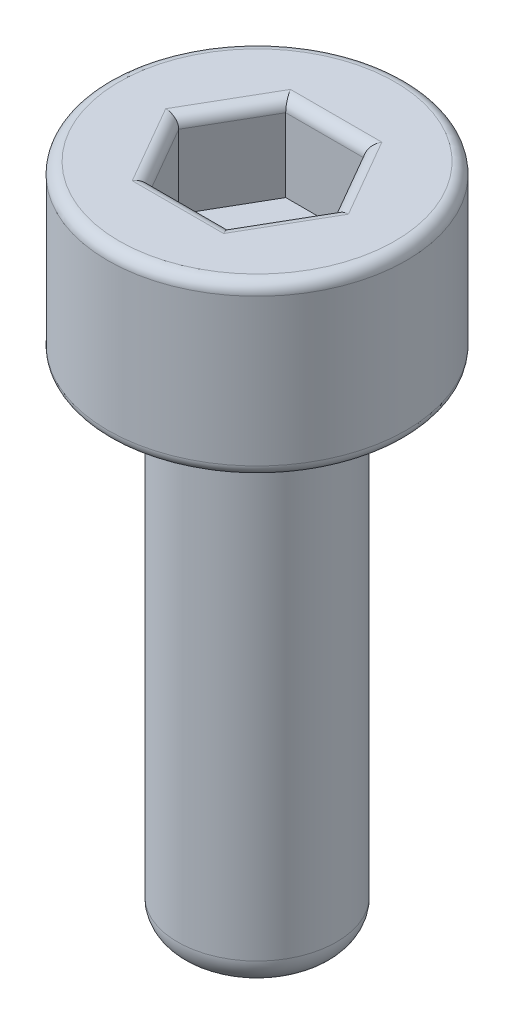
ISO-10303-21;
HEADER;
FILE_DESCRIPTION(('STEP AP214'),'2;1');
FILE_NAME('part.step','',(''),(''),'','','');
FILE_SCHEMA(('AUTOMOTIVE_DESIGN { 1 0 10303 214 1 1 1 1 }'));
ENDSEC;
DATA;
#1=APPLICATION_CONTEXT('core data for automotive mechanical design processes');
#2=APPLICATION_PROTOCOL_DEFINITION('international standard','automotive_design',2000,#1);
#3=PRODUCT_CONTEXT('',#1,'mechanical');
#4=PRODUCT('Part','Part','',(#3));
#5=PRODUCT_RELATED_PRODUCT_CATEGORY('part','',(#4));
#6=PRODUCT_DEFINITION_FORMATION('','',#4);
#7=PRODUCT_DEFINITION_CONTEXT('part definition',#1,'design');
#8=PRODUCT_DEFINITION('design','',#6,#7);
#9=PRODUCT_DEFINITION_SHAPE('','',#8);
#10=(LENGTH_UNIT() NAMED_UNIT(*) SI_UNIT(.MILLI.,.METRE.));
#11=(NAMED_UNIT(*) PLANE_ANGLE_UNIT() SI_UNIT($,.RADIAN.));
#12=(NAMED_UNIT(*) SI_UNIT($,.STERADIAN.) SOLID_ANGLE_UNIT());
#13=UNCERTAINTY_MEASURE_WITH_UNIT(LENGTH_MEASURE(1.E-05),#10,'distance_accuracy_value','');
#14=(GEOMETRIC_REPRESENTATION_CONTEXT(3) GLOBAL_UNCERTAINTY_ASSIGNED_CONTEXT((#13)) GLOBAL_UNIT_ASSIGNED_CONTEXT((#10,
#11,#12)) REPRESENTATION_CONTEXT('',''));
#15=CARTESIAN_POINT('',(0.,0.,0.));
#16=DIRECTION('',(0.,0.,1.));
#17=DIRECTION('',(1.,0.,0.));
#18=AXIS2_PLACEMENT_3D('',#15,#16,#17);
#19=CARTESIAN_POINT('',(0.,3.,0.));
#20=DIRECTION('',(0.,-1.,0.));
#21=DIRECTION('',(0.,0.,-1.));
#22=AXIS2_PLACEMENT_3D('',#19,#20,#21);
#23=CYLINDRICAL_SURFACE('',#22,2.64);
#24=CARTESIAN_POINT('',(0.,2.8,0.));
#25=DIRECTION('',(0.,1.,0.));
#26=DIRECTION('',(0.,0.,1.));
#27=AXIS2_PLACEMENT_3D('',#24,#25,#26);
#28=CIRCLE('',#27,2.64);
#29=CARTESIAN_POINT('',(0.,2.8,2.64));
#30=VERTEX_POINT('',#29);
#31=EDGE_CURVE('E186',#30,#30,#28,.F.);
#32=ORIENTED_EDGE('',*,*,#31,.T.);
#33=EDGE_LOOP('',(#32));
#34=FACE_BOUND('',#33,.T.);
#35=CARTESIAN_POINT('',(0.,0.2,0.));
#36=DIRECTION('',(0.,1.,0.));
#37=DIRECTION('',(0.,0.,1.));
#38=AXIS2_PLACEMENT_3D('',#35,#36,#37);
#39=CIRCLE('',#38,2.64);
#40=CARTESIAN_POINT('',(0.,0.2,2.64));
#41=VERTEX_POINT('',#40);
#42=EDGE_CURVE('E182',#41,#41,#39,.T.);
#43=ORIENTED_EDGE('',*,*,#42,.T.);
#44=EDGE_LOOP('',(#43));
#45=FACE_BOUND('',#44,.T.);
#46=ADVANCED_FACE('F39',(#34,#45),#23,.T.);
#47=CARTESIAN_POINT('',(0.,3.,0.));
#48=DIRECTION('',(0.,1.,0.));
#49=DIRECTION('',(0.,0.,1.));
#50=AXIS2_PLACEMENT_3D('',#47,#48,#49);
#51=PLANE('',#50);
#52=DIRECTION('',(-1.,0.,0.));
#53=VECTOR('',#52,1.);
#54=CARTESIAN_POINT('',(0.692820323027551,3.,-1.4));
#55=LINE('',#54,#53);
#56=CARTESIAN_POINT('',(-0.808290376865475,3.,-1.4));
#57=VERTEX_POINT('',#56);
#58=CARTESIAN_POINT('',(0.808290376865476,3.,-1.4));
#59=VERTEX_POINT('',#58);
#60=EDGE_CURVE('E209',#57,#59,#55,.F.);
#61=ORIENTED_EDGE('',*,*,#60,.T.);
#62=DIRECTION('',(-0.5,0.,-0.866025403784439));
#63=VECTOR('',#62,1.);
#64=CARTESIAN_POINT('',(1.55884572681199,3.,-0.0999999999999999));
#65=LINE('',#64,#63);
#66=CARTESIAN_POINT('',(1.61658075373095,3.,0.));
#67=VERTEX_POINT('',#66);
#68=EDGE_CURVE('E212',#59,#67,#65,.F.);
#69=ORIENTED_EDGE('',*,*,#68,.T.);
#70=DIRECTION('',(0.5,0.,-0.866025403784439));
#71=VECTOR('',#70,1.);
#72=CARTESIAN_POINT('',(0.866025403784438,3.,1.3));
#73=LINE('',#72,#71);
#74=CARTESIAN_POINT('',(0.808290376865476,3.,1.4));
#75=VERTEX_POINT('',#74);
#76=EDGE_CURVE('E197',#67,#75,#73,.F.);
#77=ORIENTED_EDGE('',*,*,#76,.T.);
#78=DIRECTION('',(1.,0.,0.));
#79=VECTOR('',#78,1.);
#80=CARTESIAN_POINT('',(-0.692820323027551,3.,1.4));
#81=LINE('',#80,#79);
#82=CARTESIAN_POINT('',(-0.808290376865476,3.,1.4));
#83=VERTEX_POINT('',#82);
#84=EDGE_CURVE('E200',#75,#83,#81,.F.);
#85=ORIENTED_EDGE('',*,*,#84,.T.);
#86=DIRECTION('',(0.5,0.,0.866025403784439));
#87=VECTOR('',#86,1.);
#88=CARTESIAN_POINT('',(-1.55884572681199,3.,0.1));
#89=LINE('',#88,#87);
#90=CARTESIAN_POINT('',(-1.61658075373095,3.,0.));
#91=VERTEX_POINT('',#90);
#92=EDGE_CURVE('E203',#83,#91,#89,.F.);
#93=ORIENTED_EDGE('',*,*,#92,.T.);
#94=DIRECTION('',(-0.5,0.,0.866025403784439));
#95=VECTOR('',#94,1.);
#96=CARTESIAN_POINT('',(-0.866025403784438,3.,-1.3));
#97=LINE('',#96,#95);
#98=EDGE_CURVE('E206',#91,#57,#97,.F.);
#99=ORIENTED_EDGE('',*,*,#98,.T.);
#100=EDGE_LOOP('',(#61,#69,#77,#85,#93,#99));
#101=FACE_BOUND('',#100,.T.);
#102=CARTESIAN_POINT('',(0.,3.,0.));
#103=DIRECTION('',(0.,1.,0.));
#104=DIRECTION('',(0.,0.,1.));
#105=AXIS2_PLACEMENT_3D('',#102,#103,#104);
#106=CIRCLE('',#105,2.44);
#107=CARTESIAN_POINT('',(0.,3.,2.44));
#108=VERTEX_POINT('',#107);
#109=EDGE_CURVE('E178',#108,#108,#106,.T.);
#110=ORIENTED_EDGE('',*,*,#109,.T.);
#111=EDGE_LOOP('',(#110));
#112=FACE_BOUND('',#111,.T.);
#113=ADVANCED_FACE('F261',(#101,#112),#51,.T.);
#114=CARTESIAN_POINT('',(0.,0.,0.));
#115=DIRECTION('',(0.,1.,0.));
#116=DIRECTION('',(0.,0.,1.));
#117=AXIS2_PLACEMENT_3D('',#114,#115,#116);
#118=PLANE('',#117);
#119=CARTESIAN_POINT('',(0.,0.,0.));
#120=DIRECTION('',(0.,1.,0.));
#121=DIRECTION('',(0.,0.,1.));
#122=AXIS2_PLACEMENT_3D('',#119,#120,#121);
#123=CIRCLE('',#122,2.44);
#124=CARTESIAN_POINT('',(0.,0.,2.44));
#125=VERTEX_POINT('',#124);
#126=EDGE_CURVE('E190',#125,#125,#123,.F.);
#127=ORIENTED_EDGE('',*,*,#126,.T.);
#128=EDGE_LOOP('',(#127));
#129=FACE_BOUND('',#128,.T.);
#130=CARTESIAN_POINT('',(0.,0.,0.));
#131=DIRECTION('',(0.,-1.,0.));
#132=DIRECTION('',(0.,0.,-1.));
#133=AXIS2_PLACEMENT_3D('',#130,#131,#132);
#134=CIRCLE('',#133,1.405);
#135=CARTESIAN_POINT('',(0.,0.,-1.405));
#136=VERTEX_POINT('',#135);
#137=EDGE_CURVE('E162',#136,#136,#134,.T.);
#138=ORIENTED_EDGE('',*,*,#137,.F.);
#139=EDGE_LOOP('',(#138));
#140=FACE_BOUND('',#139,.T.);
#141=ADVANCED_FACE('F267',(#129,#140),#118,.F.);
#142=CARTESIAN_POINT('',(0.,-8.76,0.));
#143=DIRECTION('',(0.,1.,0.));
#144=DIRECTION('',(0.,0.,1.));
#145=AXIS2_PLACEMENT_3D('',#142,#143,#144);
#146=CYLINDRICAL_SURFACE('',#145,1.405);
#147=CARTESIAN_POINT('',(0.,-8.26,0.));
#148=DIRECTION('',(0.,-1.,0.));
#149=DIRECTION('',(0.,0.,-1.));
#150=AXIS2_PLACEMENT_3D('',#147,#148,#149);
#151=CIRCLE('',#150,1.405);
#152=CARTESIAN_POINT('',(0.,-8.26,-1.405));
#153=VERTEX_POINT('',#152);
#154=EDGE_CURVE('E11',#153,#153,#151,.F.);
#155=ORIENTED_EDGE('',*,*,#154,.T.);
#156=EDGE_LOOP('',(#155));
#157=FACE_BOUND('',#156,.T.);
#158=ORIENTED_EDGE('',*,*,#137,.T.);
#159=EDGE_LOOP('',(#158));
#160=FACE_BOUND('',#159,.T.);
#161=ADVANCED_FACE('F342',(#157,#160),#146,.T.);
#162=CARTESIAN_POINT('',(0.,-8.76,0.));
#163=DIRECTION('',(0.,-1.,0.));
#164=DIRECTION('',(0.,0.,-1.));
#165=AXIS2_PLACEMENT_3D('',#162,#163,#164);
#166=PLANE('',#165);
#167=CARTESIAN_POINT('',(0.,-8.76,0.));
#168=DIRECTION('',(0.,-1.,0.));
#169=DIRECTION('',(0.,0.,-1.));
#170=AXIS2_PLACEMENT_3D('',#167,#168,#169);
#171=CIRCLE('',#170,0.905);
#172=CARTESIAN_POINT('',(0.,-8.76,-0.905));
#173=VERTEX_POINT('',#172);
#174=EDGE_CURVE('E48',#173,#173,#171,.T.);
#175=ORIENTED_EDGE('',*,*,#174,.T.);
#176=EDGE_LOOP('',(#175));
#177=FACE_BOUND('',#176,.T.);
#178=ADVANCED_FACE('F248',(#177),#166,.T.);
#179=CARTESIAN_POINT('',(0.,2.8,0.));
#180=DIRECTION('',(0.,1.,0.));
#181=DIRECTION('',(0.,0.,1.));
#182=AXIS2_PLACEMENT_3D('',#179,#180,#181);
#183=TOROIDAL_SURFACE('',#182,2.44,0.2);
#184=ORIENTED_EDGE('',*,*,#31,.F.);
#185=EDGE_LOOP('',(#184));
#186=FACE_BOUND('',#185,.T.);
#187=ORIENTED_EDGE('',*,*,#109,.F.);
#188=EDGE_LOOP('',(#187));
#189=FACE_BOUND('',#188,.T.);
#190=ADVANCED_FACE('F273',(#186,#189),#183,.T.);
#191=CARTESIAN_POINT('',(0.,0.2,0.));
#192=DIRECTION('',(0.,1.,0.));
#193=DIRECTION('',(0.,0.,1.));
#194=AXIS2_PLACEMENT_3D('',#191,#192,#193);
#195=TOROIDAL_SURFACE('',#194,2.44,0.2);
#196=ORIENTED_EDGE('',*,*,#126,.F.);
#197=EDGE_LOOP('',(#196));
#198=FACE_BOUND('',#197,.T.);
#199=ORIENTED_EDGE('',*,*,#42,.F.);
#200=EDGE_LOOP('',(#199));
#201=FACE_BOUND('',#200,.T.);
#202=ADVANCED_FACE('F276',(#198,#201),#195,.T.);
#203=CARTESIAN_POINT('',(0.692820323027551,1.5,1.2));
#204=DIRECTION('',(0.866025403784439,0.,0.5));
#205=DIRECTION('',(0.5,0.,-0.866025403784439));
#206=AXIS2_PLACEMENT_3D('',#203,#204,#205);
#207=PLANE('',#206);
#208=DIRECTION('',(0.,1.,0.));
#209=VECTOR('',#208,1.);
#210=CARTESIAN_POINT('',(0.692820323027551,1.5,1.2));
#211=LINE('',#210,#209);
#212=CARTESIAN_POINT('',(0.692820323027551,1.5,1.2));
#213=VERTEX_POINT('',#212);
#214=CARTESIAN_POINT('',(0.692820323027551,2.8,1.2));
#215=VERTEX_POINT('',#214);
#216=EDGE_CURVE('E159',#213,#215,#211,.T.);
#217=ORIENTED_EDGE('',*,*,#216,.T.);
#218=DIRECTION('',(0.5,0.,-0.866025403784439));
#219=VECTOR('',#218,1.);
#220=CARTESIAN_POINT('',(1.3856406460551,2.8,0.));
#221=LINE('',#220,#219);
#222=CARTESIAN_POINT('',(1.3856406460551,2.8,0.));
#223=VERTEX_POINT('',#222);
#224=EDGE_CURVE('E119',#215,#223,#221,.T.);
#225=ORIENTED_EDGE('',*,*,#224,.T.);
#226=DIRECTION('',(0.,1.,0.));
#227=VECTOR('',#226,1.);
#228=CARTESIAN_POINT('',(1.3856406460551,1.5,0.));
#229=LINE('',#228,#227);
#230=CARTESIAN_POINT('',(1.3856406460551,1.5,0.));
#231=VERTEX_POINT('',#230);
#232=EDGE_CURVE('E112',#231,#223,#229,.T.);
#233=ORIENTED_EDGE('',*,*,#232,.F.);
#234=DIRECTION('',(0.5,0.,-0.866025403784439));
#235=VECTOR('',#234,1.);
#236=CARTESIAN_POINT('',(0.692820323027551,1.5,1.2));
#237=LINE('',#236,#235);
#238=EDGE_CURVE('E116',#213,#231,#237,.T.);
#239=ORIENTED_EDGE('',*,*,#238,.F.);
#240=EDGE_LOOP('',(#217,#225,#233,#239));
#241=FACE_BOUND('',#240,.T.);
#242=ADVANCED_FACE('F114',(#241),#207,.F.);
#243=CARTESIAN_POINT('',(-0.692820323027551,1.5,1.2));
#244=DIRECTION('',(0.,0.,1.));
#245=DIRECTION('',(1.,0.,0.));
#246=AXIS2_PLACEMENT_3D('',#243,#244,#245);
#247=PLANE('',#246);
#248=DIRECTION('',(0.,1.,0.));
#249=VECTOR('',#248,1.);
#250=CARTESIAN_POINT('',(-0.692820323027551,1.5,1.2));
#251=LINE('',#250,#249);
#252=CARTESIAN_POINT('',(-0.692820323027551,1.5,1.2));
#253=VERTEX_POINT('',#252);
#254=CARTESIAN_POINT('',(-0.692820323027551,2.8,1.2));
#255=VERTEX_POINT('',#254);
#256=EDGE_CURVE('E163',#253,#255,#251,.T.);
#257=ORIENTED_EDGE('',*,*,#256,.T.);
#258=DIRECTION('',(1.,0.,0.));
#259=VECTOR('',#258,1.);
#260=CARTESIAN_POINT('',(0.692820323027551,2.8,1.2));
#261=LINE('',#260,#259);
#262=EDGE_CURVE('E55',#255,#215,#261,.T.);
#263=ORIENTED_EDGE('',*,*,#262,.T.);
#264=ORIENTED_EDGE('',*,*,#216,.F.);
#265=DIRECTION('',(1.,0.,0.));
#266=VECTOR('',#265,1.);
#267=CARTESIAN_POINT('',(-0.692820323027551,1.5,1.2));
#268=LINE('',#267,#266);
#269=EDGE_CURVE('E125',#253,#213,#268,.T.);
#270=ORIENTED_EDGE('',*,*,#269,.F.);
#271=EDGE_LOOP('',(#257,#263,#264,#270));
#272=FACE_BOUND('',#271,.T.);
#273=ADVANCED_FACE('F324',(#272),#247,.F.);
#274=CARTESIAN_POINT('',(-1.3856406460551,1.5,0.));
#275=DIRECTION('',(-0.866025403784439,0.,0.5));
#276=DIRECTION('',(0.5,0.,0.866025403784439));
#277=AXIS2_PLACEMENT_3D('',#274,#275,#276);
#278=PLANE('',#277);
#279=DIRECTION('',(0.,1.,0.));
#280=VECTOR('',#279,1.);
#281=CARTESIAN_POINT('',(-1.3856406460551,1.5,0.));
#282=LINE('',#281,#280);
#283=CARTESIAN_POINT('',(-1.3856406460551,1.5,0.));
#284=VERTEX_POINT('',#283);
#285=CARTESIAN_POINT('',(-1.3856406460551,2.8,0.));
#286=VERTEX_POINT('',#285);
#287=EDGE_CURVE('E166',#284,#286,#282,.T.);
#288=ORIENTED_EDGE('',*,*,#287,.T.);
#289=DIRECTION('',(0.5,0.,0.866025403784439));
#290=VECTOR('',#289,1.);
#291=CARTESIAN_POINT('',(-0.692820323027551,2.8,1.2));
#292=LINE('',#291,#290);
#293=EDGE_CURVE('E63',#286,#255,#292,.T.);
#294=ORIENTED_EDGE('',*,*,#293,.T.);
#295=ORIENTED_EDGE('',*,*,#256,.F.);
#296=DIRECTION('',(0.5,0.,0.866025403784439));
#297=VECTOR('',#296,1.);
#298=CARTESIAN_POINT('',(-1.3856406460551,1.5,0.));
#299=LINE('',#298,#297);
#300=EDGE_CURVE('E154',#284,#253,#299,.T.);
#301=ORIENTED_EDGE('',*,*,#300,.F.);
#302=EDGE_LOOP('',(#288,#294,#295,#301));
#303=FACE_BOUND('',#302,.T.);
#304=ADVANCED_FACE('F323',(#303),#278,.F.);
#305=CARTESIAN_POINT('',(-0.69282032302755,1.5,-1.2));
#306=DIRECTION('',(-0.866025403784439,0.,-0.5));
#307=DIRECTION('',(-0.5,0.,0.866025403784439));
#308=AXIS2_PLACEMENT_3D('',#305,#306,#307);
#309=PLANE('',#308);
#310=DIRECTION('',(0.,1.,0.));
#311=VECTOR('',#310,1.);
#312=CARTESIAN_POINT('',(-0.69282032302755,1.5,-1.2));
#313=LINE('',#312,#311);
#314=CARTESIAN_POINT('',(-0.69282032302755,1.5,-1.2));
#315=VERTEX_POINT('',#314);
#316=CARTESIAN_POINT('',(-0.69282032302755,2.8,-1.2));
#317=VERTEX_POINT('',#316);
#318=EDGE_CURVE('E169',#315,#317,#313,.T.);
#319=ORIENTED_EDGE('',*,*,#318,.T.);
#320=DIRECTION('',(-0.5,0.,0.866025403784439));
#321=VECTOR('',#320,1.);
#322=CARTESIAN_POINT('',(-1.3856406460551,2.8,0.));
#323=LINE('',#322,#321);
#324=EDGE_CURVE('E219',#317,#286,#323,.T.);
#325=ORIENTED_EDGE('',*,*,#324,.T.);
#326=ORIENTED_EDGE('',*,*,#287,.F.);
#327=DIRECTION('',(-0.5,0.,0.866025403784439));
#328=VECTOR('',#327,1.);
#329=CARTESIAN_POINT('',(-0.69282032302755,1.5,-1.2));
#330=LINE('',#329,#328);
#331=EDGE_CURVE('E150',#315,#284,#330,.T.);
#332=ORIENTED_EDGE('',*,*,#331,.F.);
#333=EDGE_LOOP('',(#319,#325,#326,#332));
#334=FACE_BOUND('',#333,.T.);
#335=ADVANCED_FACE('F322',(#334),#309,.F.);
#336=CARTESIAN_POINT('',(0.692820323027551,1.5,-1.2));
#337=DIRECTION('',(0.,0.,-1.));
#338=DIRECTION('',(-1.,0.,0.));
#339=AXIS2_PLACEMENT_3D('',#336,#337,#338);
#340=PLANE('',#339);
#341=DIRECTION('',(0.,1.,0.));
#342=VECTOR('',#341,1.);
#343=CARTESIAN_POINT('',(0.692820323027551,1.5,-1.2));
#344=LINE('',#343,#342);
#345=CARTESIAN_POINT('',(0.692820323027551,1.5,-1.2));
#346=VERTEX_POINT('',#345);
#347=CARTESIAN_POINT('',(0.692820323027551,2.8,-1.2));
#348=VERTEX_POINT('',#347);
#349=EDGE_CURVE('E124',#346,#348,#344,.T.);
#350=ORIENTED_EDGE('',*,*,#349,.T.);
#351=DIRECTION('',(-1.,0.,0.));
#352=VECTOR('',#351,1.);
#353=CARTESIAN_POINT('',(-0.69282032302755,2.8,-1.2));
#354=LINE('',#353,#352);
#355=EDGE_CURVE('E216',#348,#317,#354,.T.);
#356=ORIENTED_EDGE('',*,*,#355,.T.);
#357=ORIENTED_EDGE('',*,*,#318,.F.);
#358=DIRECTION('',(-1.,0.,0.));
#359=VECTOR('',#358,1.);
#360=CARTESIAN_POINT('',(0.692820323027551,1.5,-1.2));
#361=LINE('',#360,#359);
#362=EDGE_CURVE('E135',#346,#315,#361,.T.);
#363=ORIENTED_EDGE('',*,*,#362,.F.);
#364=EDGE_LOOP('',(#350,#356,#357,#363));
#365=FACE_BOUND('',#364,.T.);
#366=ADVANCED_FACE('F318',(#365),#340,.F.);
#367=CARTESIAN_POINT('',(1.3856406460551,1.5,0.));
#368=DIRECTION('',(0.866025403784439,0.,-0.5));
#369=DIRECTION('',(-0.5,0.,-0.866025403784439));
#370=AXIS2_PLACEMENT_3D('',#367,#368,#369);
#371=PLANE('',#370);
#372=ORIENTED_EDGE('',*,*,#232,.T.);
#373=DIRECTION('',(-0.5,0.,-0.866025403784439));
#374=VECTOR('',#373,1.);
#375=CARTESIAN_POINT('',(0.692820323027551,2.8,-1.2));
#376=LINE('',#375,#374);
#377=EDGE_CURVE('E194',#223,#348,#376,.T.);
#378=ORIENTED_EDGE('',*,*,#377,.T.);
#379=ORIENTED_EDGE('',*,*,#349,.F.);
#380=DIRECTION('',(-0.5,0.,-0.866025403784439));
#381=VECTOR('',#380,1.);
#382=CARTESIAN_POINT('',(1.3856406460551,1.5,0.));
#383=LINE('',#382,#381);
#384=EDGE_CURVE('E128',#231,#346,#383,.T.);
#385=ORIENTED_EDGE('',*,*,#384,.F.);
#386=EDGE_LOOP('',(#372,#378,#379,#385));
#387=FACE_BOUND('',#386,.T.);
#388=ADVANCED_FACE('F129',(#387),#371,.F.);
#389=CARTESIAN_POINT('',(0.,1.5,0.));
#390=DIRECTION('',(0.,1.,0.));
#391=DIRECTION('',(0.,0.,1.));
#392=AXIS2_PLACEMENT_3D('',#389,#390,#391);
#393=PLANE('',#392);
#394=ORIENTED_EDGE('',*,*,#238,.T.);
#395=ORIENTED_EDGE('',*,*,#384,.T.);
#396=ORIENTED_EDGE('',*,*,#362,.T.);
#397=ORIENTED_EDGE('',*,*,#331,.T.);
#398=ORIENTED_EDGE('',*,*,#300,.T.);
#399=ORIENTED_EDGE('',*,*,#269,.T.);
#400=EDGE_LOOP('',(#394,#395,#396,#397,#398,#399));
#401=FACE_BOUND('',#400,.T.);
#402=ADVANCED_FACE('F137',(#401),#393,.T.);
#403=CARTESIAN_POINT('',(-1.55884572681199,2.8,0.1));
#404=DIRECTION('',(-0.5,0.,-0.866025403784439));
#405=DIRECTION('',(-0.866025403784439,0.,0.5));
#406=AXIS2_PLACEMENT_3D('',#403,#404,#405);
#407=CYLINDRICAL_SURFACE('',#406,0.2);
#408=CARTESIAN_POINT('',(-1.61658075373095,2.8,0.));
#409=DIRECTION('',(0.,0.,-1.));
#410=DIRECTION('',(1.,0.,0.));
#411=AXIS2_PLACEMENT_3D('',#408,#409,#410);
#412=ELLIPSE('',#411,0.23094010767585,0.2);
#413=EDGE_CURVE('E145',#91,#286,#412,.T.);
#414=ORIENTED_EDGE('',*,*,#413,.F.);
#415=ORIENTED_EDGE('',*,*,#92,.F.);
#416=CARTESIAN_POINT('',(-0.808290376865476,2.8,1.4));
#417=DIRECTION('',(-0.866025403784438,0.,-0.5));
#418=DIRECTION('',(0.5,0.,-0.866025403784439));
#419=AXIS2_PLACEMENT_3D('',#416,#417,#418);
#420=ELLIPSE('',#419,0.23094010767585,0.2);
#421=EDGE_CURVE('E141',#255,#83,#420,.F.);
#422=ORIENTED_EDGE('',*,*,#421,.F.);
#423=ORIENTED_EDGE('',*,*,#293,.F.);
#424=EDGE_LOOP('',(#414,#415,#422,#423));
#425=FACE_BOUND('',#424,.T.);
#426=ADVANCED_FACE('F294',(#425),#407,.T.);
#427=CARTESIAN_POINT('',(-0.692820323027551,2.8,1.4));
#428=DIRECTION('',(-1.,0.,0.));
#429=DIRECTION('',(0.,0.,1.));
#430=AXIS2_PLACEMENT_3D('',#427,#428,#429);
#431=CYLINDRICAL_SURFACE('',#430,0.2);
#432=ORIENTED_EDGE('',*,*,#421,.T.);
#433=ORIENTED_EDGE('',*,*,#84,.F.);
#434=CARTESIAN_POINT('',(0.808290376865476,2.8,1.4));
#435=DIRECTION('',(-0.866025403784439,0.,0.5));
#436=DIRECTION('',(-0.5,0.,-0.866025403784439));
#437=AXIS2_PLACEMENT_3D('',#434,#435,#436);
#438=ELLIPSE('',#437,0.23094010767585,0.2);
#439=EDGE_CURVE('E238',#215,#75,#438,.F.);
#440=ORIENTED_EDGE('',*,*,#439,.F.);
#441=ORIENTED_EDGE('',*,*,#262,.F.);
#442=EDGE_LOOP('',(#432,#433,#440,#441));
#443=FACE_BOUND('',#442,.T.);
#444=ADVANCED_FACE('F291',(#443),#431,.T.);
#445=CARTESIAN_POINT('',(-0.866025403784438,2.8,-1.3));
#446=DIRECTION('',(0.5,0.,-0.866025403784439));
#447=DIRECTION('',(-0.866025403784439,0.,-0.5));
#448=AXIS2_PLACEMENT_3D('',#445,#446,#447);
#449=CYLINDRICAL_SURFACE('',#448,0.2);
#450=ORIENTED_EDGE('',*,*,#413,.T.);
#451=ORIENTED_EDGE('',*,*,#324,.F.);
#452=CARTESIAN_POINT('',(-0.808290376865475,2.8,-1.4));
#453=DIRECTION('',(0.866025403784439,0.,-0.5));
#454=DIRECTION('',(0.5,0.,0.866025403784439));
#455=AXIS2_PLACEMENT_3D('',#452,#453,#454);
#456=ELLIPSE('',#455,0.23094010767585,0.2);
#457=EDGE_CURVE('E234',#57,#317,#456,.T.);
#458=ORIENTED_EDGE('',*,*,#457,.F.);
#459=ORIENTED_EDGE('',*,*,#98,.F.);
#460=EDGE_LOOP('',(#450,#451,#458,#459));
#461=FACE_BOUND('',#460,.T.);
#462=ADVANCED_FACE('F287',(#461),#449,.T.);
#463=CARTESIAN_POINT('',(0.866025403784438,2.8,1.3));
#464=DIRECTION('',(-0.5,0.,0.866025403784439));
#465=DIRECTION('',(0.866025403784439,0.,0.5));
#466=AXIS2_PLACEMENT_3D('',#463,#464,#465);
#467=CYLINDRICAL_SURFACE('',#466,0.2);
#468=ORIENTED_EDGE('',*,*,#439,.T.);
#469=ORIENTED_EDGE('',*,*,#76,.F.);
#470=CARTESIAN_POINT('',(1.61658075373095,2.8,0.));
#471=DIRECTION('',(0.,0.,1.));
#472=DIRECTION('',(1.,0.,0.));
#473=AXIS2_PLACEMENT_3D('',#470,#471,#472);
#474=ELLIPSE('',#473,0.23094010767585,0.2);
#475=EDGE_CURVE('E231',#223,#67,#474,.F.);
#476=ORIENTED_EDGE('',*,*,#475,.F.);
#477=ORIENTED_EDGE('',*,*,#224,.F.);
#478=EDGE_LOOP('',(#468,#469,#476,#477));
#479=FACE_BOUND('',#478,.T.);
#480=ADVANCED_FACE('F283',(#479),#467,.T.);
#481=CARTESIAN_POINT('',(0.692820323027551,2.8,-1.4));
#482=DIRECTION('',(1.,0.,0.));
#483=DIRECTION('',(0.,0.,-1.));
#484=AXIS2_PLACEMENT_3D('',#481,#482,#483);
#485=CYLINDRICAL_SURFACE('',#484,0.2);
#486=ORIENTED_EDGE('',*,*,#457,.T.);
#487=ORIENTED_EDGE('',*,*,#355,.F.);
#488=CARTESIAN_POINT('',(0.808290376865476,2.8,-1.4));
#489=DIRECTION('',(0.866025403784439,0.,0.5));
#490=DIRECTION('',(-0.5,0.,0.866025403784439));
#491=AXIS2_PLACEMENT_3D('',#488,#489,#490);
#492=ELLIPSE('',#491,0.23094010767585,0.2);
#493=EDGE_CURVE('E228',#59,#348,#492,.T.);
#494=ORIENTED_EDGE('',*,*,#493,.F.);
#495=ORIENTED_EDGE('',*,*,#60,.F.);
#496=EDGE_LOOP('',(#486,#487,#494,#495));
#497=FACE_BOUND('',#496,.T.);
#498=ADVANCED_FACE('F256',(#497),#485,.T.);
#499=CARTESIAN_POINT('',(1.55884572681199,2.8,-0.0999999999999997));
#500=DIRECTION('',(0.5,0.,0.866025403784439));
#501=DIRECTION('',(0.866025403784439,0.,-0.5));
#502=AXIS2_PLACEMENT_3D('',#499,#500,#501);
#503=CYLINDRICAL_SURFACE('',#502,0.2);
#504=ORIENTED_EDGE('',*,*,#475,.T.);
#505=ORIENTED_EDGE('',*,*,#68,.F.);
#506=ORIENTED_EDGE('',*,*,#493,.T.);
#507=ORIENTED_EDGE('',*,*,#377,.F.);
#508=EDGE_LOOP('',(#504,#505,#506,#507));
#509=FACE_BOUND('',#508,.T.);
#510=ADVANCED_FACE('F251',(#509),#503,.T.);
#511=CARTESIAN_POINT('',(0.,-8.26,0.));
#512=DIRECTION('',(0.,-1.,0.));
#513=DIRECTION('',(0.,0.,-1.));
#514=AXIS2_PLACEMENT_3D('',#511,#512,#513);
#515=TOROIDAL_SURFACE('',#514,0.905,0.5);
#516=ORIENTED_EDGE('',*,*,#154,.F.);
#517=EDGE_LOOP('',(#516));
#518=FACE_BOUND('',#517,.T.);
#519=ORIENTED_EDGE('',*,*,#174,.F.);
#520=EDGE_LOOP('',(#519));
#521=FACE_BOUND('',#520,.T.);
#522=ADVANCED_FACE('F41',(#518,#521),#515,.T.);
#523=CLOSED_SHELL('',(#46,#113,#141,#161,#178,#190,#202,#242,#273,#304,#335,#366,#388,#402,#426,
#444,#462,#480,#498,#510,#522));
#524=MANIFOLD_SOLID_BREP('B2',#523);
#525=ADVANCED_BREP_SHAPE_REPRESENTATION('',(#18,#524),#14);
#526=SHAPE_DEFINITION_REPRESENTATION(#9,#525);
ENDSEC;
END-ISO-10303-21;
